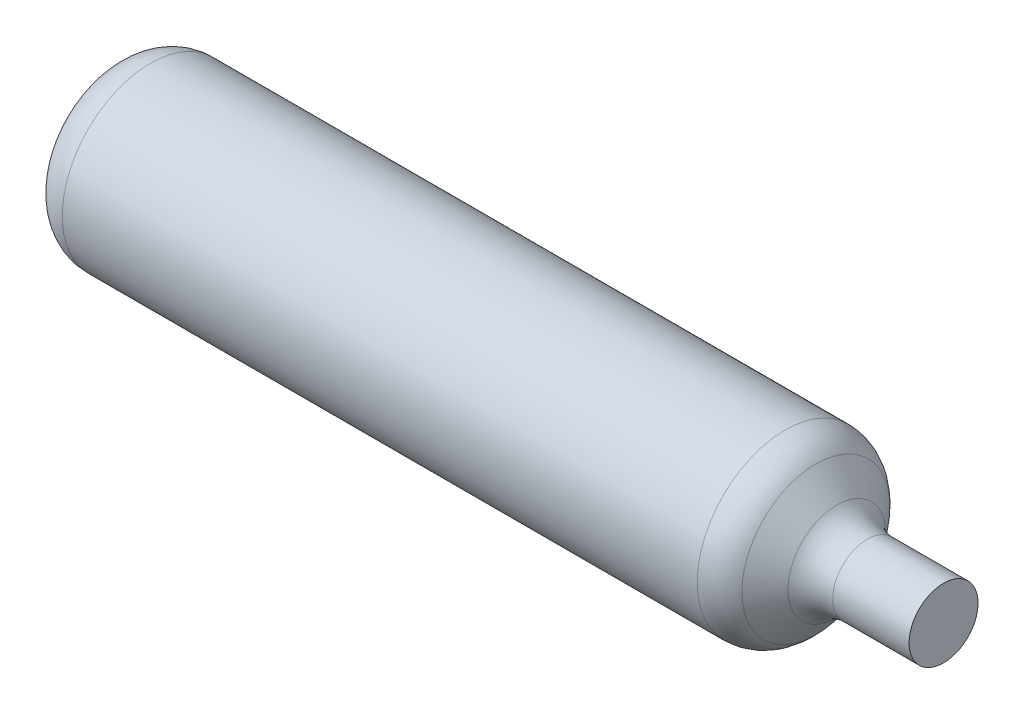
ISO-10303-21;
HEADER;
FILE_DESCRIPTION(('STEP AP214'),'2;1');
FILE_NAME('part.step','',(''),(''),'','','');
FILE_SCHEMA(('AUTOMOTIVE_DESIGN { 1 0 10303 214 1 1 1 1 }'));
ENDSEC;
DATA;
#1=APPLICATION_CONTEXT('core data for automotive mechanical design processes');
#2=APPLICATION_PROTOCOL_DEFINITION('international standard','automotive_design',2000,#1);
#3=PRODUCT_CONTEXT('',#1,'mechanical');
#4=PRODUCT('Part','Part','',(#3));
#5=PRODUCT_RELATED_PRODUCT_CATEGORY('part','',(#4));
#6=PRODUCT_DEFINITION_FORMATION('','',#4);
#7=PRODUCT_DEFINITION_CONTEXT('part definition',#1,'design');
#8=PRODUCT_DEFINITION('design','',#6,#7);
#9=PRODUCT_DEFINITION_SHAPE('','',#8);
#10=(LENGTH_UNIT() NAMED_UNIT(*) SI_UNIT(.MILLI.,.METRE.));
#11=(NAMED_UNIT(*) PLANE_ANGLE_UNIT() SI_UNIT($,.RADIAN.));
#12=(NAMED_UNIT(*) SI_UNIT($,.STERADIAN.) SOLID_ANGLE_UNIT());
#13=UNCERTAINTY_MEASURE_WITH_UNIT(LENGTH_MEASURE(1.E-05),#10,'distance_accuracy_value','');
#14=(GEOMETRIC_REPRESENTATION_CONTEXT(3) GLOBAL_UNCERTAINTY_ASSIGNED_CONTEXT((#13)) GLOBAL_UNIT_ASSIGNED_CONTEXT((#10,
#11,#12)) REPRESENTATION_CONTEXT('',''));
#15=CARTESIAN_POINT('',(0.,0.,0.));
#16=DIRECTION('',(0.,0.,1.));
#17=DIRECTION('',(1.,0.,0.));
#18=AXIS2_PLACEMENT_3D('',#15,#16,#17);
#19=CARTESIAN_POINT('',(0.,0.,0.));
#20=DIRECTION('',(1.,0.,0.));
#21=DIRECTION('',(0.,0.,-1.));
#22=AXIS2_PLACEMENT_3D('',#19,#20,#21);
#23=PLANE('',#22);
#24=CARTESIAN_POINT('',(0.,0.,0.));
#25=DIRECTION('',(1.,0.,0.));
#26=DIRECTION('',(0.,0.,-1.));
#27=AXIS2_PLACEMENT_3D('',#24,#25,#26);
#28=CIRCLE('',#27,24.5);
#29=CARTESIAN_POINT('',(0.,0.,-24.5));
#30=VERTEX_POINT('',#29);
#31=EDGE_CURVE('E10',#30,#30,#28,.F.);
#32=ORIENTED_EDGE('',*,*,#31,.T.);
#33=EDGE_LOOP('',(#32));
#34=FACE_BOUND('',#33,.T.);
#35=ADVANCED_FACE('F43',(#34),#23,.F.);
#36=CARTESIAN_POINT('',(0.,0.,0.));
#37=DIRECTION('',(-1.,0.,0.));
#38=DIRECTION('',(0.,0.,1.));
#39=AXIS2_PLACEMENT_3D('',#36,#37,#38);
#40=CYLINDRICAL_SURFACE('',#39,44.5);
#41=CARTESIAN_POINT('',(340.21936846764,0.,0.));
#42=DIRECTION('',(1.,0.,0.));
#43=DIRECTION('',(0.,0.,-1.));
#44=AXIS2_PLACEMENT_3D('',#41,#42,#43);
#45=CIRCLE('',#44,44.5);
#46=CARTESIAN_POINT('',(340.21936846764,0.,-44.5));
#47=VERTEX_POINT('',#46);
#48=EDGE_CURVE('E51',#47,#47,#45,.F.);
#49=ORIENTED_EDGE('',*,*,#48,.T.);
#50=EDGE_LOOP('',(#49));
#51=FACE_BOUND('',#50,.T.);
#52=CARTESIAN_POINT('',(20.,0.,0.));
#53=DIRECTION('',(1.,0.,0.));
#54=DIRECTION('',(0.,0.,-1.));
#55=AXIS2_PLACEMENT_3D('',#52,#53,#54);
#56=CIRCLE('',#55,44.5);
#57=CARTESIAN_POINT('',(20.,0.,-44.5));
#58=VERTEX_POINT('',#57);
#59=EDGE_CURVE('E56',#58,#58,#56,.T.);
#60=ORIENTED_EDGE('',*,*,#59,.T.);
#61=EDGE_LOOP('',(#60));
#62=FACE_BOUND('',#61,.T.);
#63=ADVANCED_FACE('F97',(#51,#62),#40,.T.);
#64=CARTESIAN_POINT('',(372.134762872755,0.,0.));
#65=DIRECTION('',(-1.,0.,0.));
#66=DIRECTION('',(0.,0.,1.));
#67=AXIS2_PLACEMENT_3D('',#64,#65,#66);
#68=CONICAL_SURFACE('',#67,17.400641025641,0.877094319657312);
#69=CARTESIAN_POINT('',(366.137215461902,0.,0.));
#70=DIRECTION('',(-1.,0.,0.));
#71=DIRECTION('',(0.,0.,1.));
#72=AXIS2_PLACEMENT_3D('',#69,#70,#71);
#73=CIRCLE('',#72,24.6128815829963);
#74=CARTESIAN_POINT('',(366.137215461902,0.,24.6128815829963));
#75=VERTEX_POINT('',#74);
#76=EDGE_CURVE('E67',#75,#75,#73,.T.);
#77=ORIENTED_EDGE('',*,*,#76,.T.);
#78=EDGE_LOOP('',(#77));
#79=FACE_BOUND('',#78,.T.);
#80=CARTESIAN_POINT('',(355.597053873352,0.,0.));
#81=DIRECTION('',(1.,0.,0.));
#82=DIRECTION('',(0.,0.,-1.));
#83=AXIS2_PLACEMENT_3D('',#80,#81,#82);
#84=CIRCLE('',#83,37.2877594426447);
#85=CARTESIAN_POINT('',(355.597053873352,0.,-37.2877594426447));
#86=VERTEX_POINT('',#85);
#87=EDGE_CURVE('E71',#86,#86,#84,.T.);
#88=ORIENTED_EDGE('',*,*,#87,.T.);
#89=EDGE_LOOP('',(#88));
#90=FACE_BOUND('',#89,.T.);
#91=ADVANCED_FACE('F94',(#79,#90),#68,.T.);
#92=CARTESIAN_POINT('',(0.,0.,0.));
#93=DIRECTION('',(-1.,0.,0.));
#94=DIRECTION('',(0.,0.,1.));
#95=AXIS2_PLACEMENT_3D('',#92,#93,#94);
#96=CYLINDRICAL_SURFACE('',#95,17.400641025641);
#97=CARTESIAN_POINT('',(381.514900867614,0.,0.));
#98=DIRECTION('',(-1.,0.,0.));
#99=DIRECTION('',(0.,0.,1.));
#100=AXIS2_PLACEMENT_3D('',#97,#98,#99);
#101=CIRCLE('',#100,17.400641025641);
#102=CARTESIAN_POINT('',(381.514900867614,0.,17.400641025641));
#103=VERTEX_POINT('',#102);
#104=EDGE_CURVE('E61',#103,#103,#101,.F.);
#105=ORIENTED_EDGE('',*,*,#104,.T.);
#106=EDGE_LOOP('',(#105));
#107=FACE_BOUND('',#106,.T.);
#108=CARTESIAN_POINT('',(420.,0.,0.));
#109=DIRECTION('',(-1.,0.,0.));
#110=DIRECTION('',(0.,0.,1.));
#111=AXIS2_PLACEMENT_3D('',#108,#109,#110);
#112=CIRCLE('',#111,17.400641025641);
#113=CARTESIAN_POINT('',(420.,0.,17.400641025641));
#114=VERTEX_POINT('',#113);
#115=EDGE_CURVE('E75',#114,#114,#112,.T.);
#116=ORIENTED_EDGE('',*,*,#115,.T.);
#117=EDGE_LOOP('',(#116));
#118=FACE_BOUND('',#117,.T.);
#119=ADVANCED_FACE('F80',(#107,#118),#96,.T.);
#120=CARTESIAN_POINT('',(420.,17.400641025641,0.));
#121=DIRECTION('',(-1.,0.,0.));
#122=DIRECTION('',(0.,0.,1.));
#123=AXIS2_PLACEMENT_3D('',#120,#121,#122);
#124=PLANE('',#123);
#125=ORIENTED_EDGE('',*,*,#115,.F.);
#126=EDGE_LOOP('',(#125));
#127=FACE_BOUND('',#126,.T.);
#128=ADVANCED_FACE('F82',(#127),#124,.F.);
#129=CARTESIAN_POINT('',(381.514900867614,0.,0.));
#130=DIRECTION('',(-1.,0.,0.));
#131=DIRECTION('',(0.,0.,1.));
#132=AXIS2_PLACEMENT_3D('',#129,#130,#131);
#133=TOROIDAL_SURFACE('',#132,37.400641025641,20.);
#134=ORIENTED_EDGE('',*,*,#104,.F.);
#135=EDGE_LOOP('',(#134));
#136=FACE_BOUND('',#135,.T.);
#137=ORIENTED_EDGE('',*,*,#76,.F.);
#138=EDGE_LOOP('',(#137));
#139=FACE_BOUND('',#138,.T.);
#140=ADVANCED_FACE('F84',(#136,#139),#133,.F.);
#141=CARTESIAN_POINT('',(340.21936846764,0.,0.));
#142=DIRECTION('',(1.,0.,0.));
#143=DIRECTION('',(0.,0.,-1.));
#144=AXIS2_PLACEMENT_3D('',#141,#142,#143);
#145=TOROIDAL_SURFACE('',#144,24.5,20.);
#146=ORIENTED_EDGE('',*,*,#87,.F.);
#147=EDGE_LOOP('',(#146));
#148=FACE_BOUND('',#147,.T.);
#149=ORIENTED_EDGE('',*,*,#48,.F.);
#150=EDGE_LOOP('',(#149));
#151=FACE_BOUND('',#150,.T.);
#152=ADVANCED_FACE('F90',(#148,#151),#145,.T.);
#153=CARTESIAN_POINT('',(20.,0.,0.));
#154=DIRECTION('',(1.,0.,0.));
#155=DIRECTION('',(0.,0.,-1.));
#156=AXIS2_PLACEMENT_3D('',#153,#154,#155);
#157=TOROIDAL_SURFACE('',#156,24.5,20.);
#158=ORIENTED_EDGE('',*,*,#59,.F.);
#159=EDGE_LOOP('',(#158));
#160=FACE_BOUND('',#159,.T.);
#161=ORIENTED_EDGE('',*,*,#31,.F.);
#162=EDGE_LOOP('',(#161));
#163=FACE_BOUND('',#162,.T.);
#164=ADVANCED_FACE('F45',(#160,#163),#157,.T.);
#165=CLOSED_SHELL('',(#35,#63,#91,#119,#128,#140,#152,#164));
#166=MANIFOLD_SOLID_BREP('B2',#165);
#167=ADVANCED_BREP_SHAPE_REPRESENTATION('',(#18,#166),#14);
#168=SHAPE_DEFINITION_REPRESENTATION(#9,#167);
ENDSEC;
END-ISO-10303-21;
